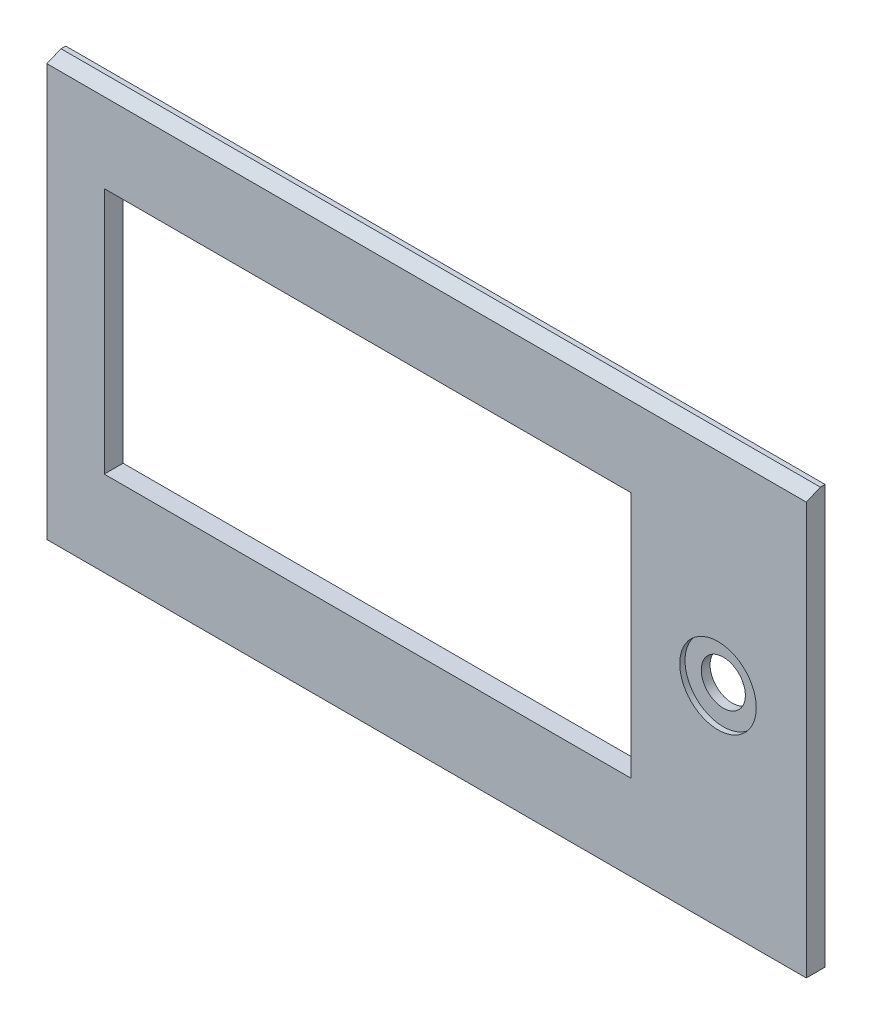
ISO-10303-21;
HEADER;
FILE_DESCRIPTION(('STEP AP214'),'2;1');
FILE_NAME('part.step','',(''),(''),'','','');
FILE_SCHEMA(('AUTOMOTIVE_DESIGN { 1 0 10303 214 1 1 1 1 }'));
ENDSEC;
DATA;
#1=APPLICATION_CONTEXT('core data for automotive mechanical design processes');
#2=APPLICATION_PROTOCOL_DEFINITION('international standard','automotive_design',2000,#1);
#3=PRODUCT_CONTEXT('',#1,'mechanical');
#4=PRODUCT('Part','Part','',(#3));
#5=PRODUCT_RELATED_PRODUCT_CATEGORY('part','',(#4));
#6=PRODUCT_DEFINITION_FORMATION('','',#4);
#7=PRODUCT_DEFINITION_CONTEXT('part definition',#1,'design');
#8=PRODUCT_DEFINITION('design','',#6,#7);
#9=PRODUCT_DEFINITION_SHAPE('','',#8);
#10=(LENGTH_UNIT() NAMED_UNIT(*) SI_UNIT(.MILLI.,.METRE.));
#11=(NAMED_UNIT(*) PLANE_ANGLE_UNIT() SI_UNIT($,.RADIAN.));
#12=(NAMED_UNIT(*) SI_UNIT($,.STERADIAN.) SOLID_ANGLE_UNIT());
#13=UNCERTAINTY_MEASURE_WITH_UNIT(LENGTH_MEASURE(1.E-05),#10,'distance_accuracy_value','');
#14=(GEOMETRIC_REPRESENTATION_CONTEXT(3) GLOBAL_UNCERTAINTY_ASSIGNED_CONTEXT((#13)) GLOBAL_UNIT_ASSIGNED_CONTEXT((#10,
#11,#12)) REPRESENTATION_CONTEXT('',''));
#15=CARTESIAN_POINT('',(0.,0.,0.));
#16=DIRECTION('',(0.,0.,1.));
#17=DIRECTION('',(1.,0.,0.));
#18=AXIS2_PLACEMENT_3D('',#15,#16,#17);
#19=CARTESIAN_POINT('',(104.25,21.,3.2));
#20=DIRECTION('',(0.,0.,-1.));
#21=DIRECTION('',(-1.,0.,0.));
#22=AXIS2_PLACEMENT_3D('',#19,#20,#21);
#23=CYLINDRICAL_SURFACE('',#22,3.75000000000001);
#24=CARTESIAN_POINT('',(104.25,21.,0.8));
#25=DIRECTION('',(0.,0.,1.));
#26=DIRECTION('',(1.,0.,0.));
#27=AXIS2_PLACEMENT_3D('',#24,#25,#26);
#28=CIRCLE('',#27,3.75000000000001);
#29=CARTESIAN_POINT('',(108.,21.,0.8));
#30=VERTEX_POINT('',#29);
#31=EDGE_CURVE('E175',#30,#30,#28,.T.);
#32=ORIENTED_EDGE('',*,*,#31,.F.);
#33=EDGE_LOOP('',(#32));
#34=FACE_BOUND('',#33,.T.);
#35=CARTESIAN_POINT('',(104.25,21.,2.3));
#36=DIRECTION('',(0.,0.,1.));
#37=DIRECTION('',(1.,0.,0.));
#38=AXIS2_PLACEMENT_3D('',#35,#36,#37);
#39=CIRCLE('',#38,3.75000000000001);
#40=CARTESIAN_POINT('',(108.,21.,2.3));
#41=VERTEX_POINT('',#40);
#42=EDGE_CURVE('E45',#41,#41,#39,.T.);
#43=ORIENTED_EDGE('',*,*,#42,.T.);
#44=EDGE_LOOP('',(#43));
#45=FACE_BOUND('',#44,.T.);
#46=ADVANCED_FACE('F41',(#34,#45),#23,.F.);
#47=CARTESIAN_POINT('',(89.5,0.,3.2));
#48=DIRECTION('',(-1.,0.,0.));
#49=DIRECTION('',(0.,0.,1.));
#50=AXIS2_PLACEMENT_3D('',#47,#48,#49);
#51=PLANE('',#50);
#52=DIRECTION('',(0.,1.,0.));
#53=VECTOR('',#52,1.);
#54=CARTESIAN_POINT('',(89.5,0.,0.));
#55=LINE('',#54,#53);
#56=CARTESIAN_POINT('',(89.5,0.,0.));
#57=VERTEX_POINT('',#56);
#58=CARTESIAN_POINT('',(89.5,42.,0.));
#59=VERTEX_POINT('',#58);
#60=EDGE_CURVE('E211',#57,#59,#55,.T.);
#61=ORIENTED_EDGE('',*,*,#60,.F.);
#62=DIRECTION('',(0.,0.,-1.));
#63=VECTOR('',#62,1.);
#64=CARTESIAN_POINT('',(89.5,0.,3.2));
#65=LINE('',#64,#63);
#66=CARTESIAN_POINT('',(89.5,0.,3.2));
#67=VERTEX_POINT('',#66);
#68=EDGE_CURVE('E230',#67,#57,#65,.T.);
#69=ORIENTED_EDGE('',*,*,#68,.F.);
#70=DIRECTION('',(0.,1.,0.));
#71=VECTOR('',#70,1.);
#72=CARTESIAN_POINT('',(89.5,0.,3.2));
#73=LINE('',#72,#71);
#74=CARTESIAN_POINT('',(89.5,42.,3.2));
#75=VERTEX_POINT('',#74);
#76=EDGE_CURVE('E187',#67,#75,#73,.T.);
#77=ORIENTED_EDGE('',*,*,#76,.T.);
#78=DIRECTION('',(0.,0.,-1.));
#79=VECTOR('',#78,1.);
#80=CARTESIAN_POINT('',(89.5,42.,3.2));
#81=LINE('',#80,#79);
#82=EDGE_CURVE('E222',#75,#59,#81,.T.);
#83=ORIENTED_EDGE('',*,*,#82,.T.);
#84=EDGE_LOOP('',(#61,#69,#77,#83));
#85=FACE_BOUND('',#84,.T.);
#86=ADVANCED_FACE('F250',(#85),#51,.T.);
#87=CARTESIAN_POINT('',(0.,0.,3.2));
#88=DIRECTION('',(0.,1.,0.));
#89=DIRECTION('',(0.,0.,1.));
#90=AXIS2_PLACEMENT_3D('',#87,#88,#89);
#91=PLANE('',#90);
#92=DIRECTION('',(1.,0.,0.));
#93=VECTOR('',#92,1.);
#94=CARTESIAN_POINT('',(0.,0.,0.));
#95=LINE('',#94,#93);
#96=CARTESIAN_POINT('',(0.,0.,0.));
#97=VERTEX_POINT('',#96);
#98=EDGE_CURVE('E214',#97,#57,#95,.T.);
#99=ORIENTED_EDGE('',*,*,#98,.F.);
#100=DIRECTION('',(0.,0.,-1.));
#101=VECTOR('',#100,1.);
#102=CARTESIAN_POINT('',(0.,0.,3.2));
#103=LINE('',#102,#101);
#104=CARTESIAN_POINT('',(0.,0.,3.2));
#105=VERTEX_POINT('',#104);
#106=EDGE_CURVE('E228',#105,#97,#103,.T.);
#107=ORIENTED_EDGE('',*,*,#106,.F.);
#108=DIRECTION('',(1.,0.,0.));
#109=VECTOR('',#108,1.);
#110=CARTESIAN_POINT('',(0.,0.,3.2));
#111=LINE('',#110,#109);
#112=EDGE_CURVE('E190',#105,#67,#111,.T.);
#113=ORIENTED_EDGE('',*,*,#112,.T.);
#114=ORIENTED_EDGE('',*,*,#68,.T.);
#115=EDGE_LOOP('',(#99,#107,#113,#114));
#116=FACE_BOUND('',#115,.T.);
#117=ADVANCED_FACE('F275',(#116),#91,.T.);
#118=CARTESIAN_POINT('',(0.,0.,3.2));
#119=DIRECTION('',(-1.,0.,0.));
#120=DIRECTION('',(0.,0.,1.));
#121=AXIS2_PLACEMENT_3D('',#118,#119,#120);
#122=PLANE('',#121);
#123=DIRECTION('',(0.,1.,0.));
#124=VECTOR('',#123,1.);
#125=CARTESIAN_POINT('',(0.,0.,0.));
#126=LINE('',#125,#124);
#127=CARTESIAN_POINT('',(0.,42.,0.));
#128=VERTEX_POINT('',#127);
#129=EDGE_CURVE('E217',#97,#128,#126,.T.);
#130=ORIENTED_EDGE('',*,*,#129,.T.);
#131=DIRECTION('',(0.,0.,-1.));
#132=VECTOR('',#131,1.);
#133=CARTESIAN_POINT('',(0.,42.,3.2));
#134=LINE('',#133,#132);
#135=CARTESIAN_POINT('',(0.,42.,3.2));
#136=VERTEX_POINT('',#135);
#137=EDGE_CURVE('E224',#136,#128,#134,.T.);
#138=ORIENTED_EDGE('',*,*,#137,.F.);
#139=DIRECTION('',(0.,1.,0.));
#140=VECTOR('',#139,1.);
#141=CARTESIAN_POINT('',(0.,0.,3.2));
#142=LINE('',#141,#140);
#143=EDGE_CURVE('E193',#105,#136,#142,.T.);
#144=ORIENTED_EDGE('',*,*,#143,.F.);
#145=ORIENTED_EDGE('',*,*,#106,.T.);
#146=EDGE_LOOP('',(#130,#138,#144,#145));
#147=FACE_BOUND('',#146,.T.);
#148=ADVANCED_FACE('F281',(#147),#122,.F.);
#149=CARTESIAN_POINT('',(119.25,0.,3.2));
#150=DIRECTION('',(1.,0.,0.));
#151=DIRECTION('',(0.,0.,-1.));
#152=AXIS2_PLACEMENT_3D('',#149,#150,#151);
#153=PLANE('',#152);
#154=DIRECTION('',(0.,0.,-1.));
#155=VECTOR('',#154,1.);
#156=CARTESIAN_POINT('',(119.25,56.5,3.2));
#157=LINE('',#156,#155);
#158=CARTESIAN_POINT('',(119.25,56.5,0.799999999999959));
#159=VERTEX_POINT('',#158);
#160=CARTESIAN_POINT('',(119.25,56.5,0.));
#161=VERTEX_POINT('',#160);
#162=EDGE_CURVE('E225',#159,#161,#157,.T.);
#163=ORIENTED_EDGE('',*,*,#162,.F.);
#164=DIRECTION('',(0.,0.382683432365086,-0.923879532511289));
#165=VECTOR('',#164,1.);
#166=CARTESIAN_POINT('',(119.25,47.3772384310963,22.8242947059437));
#167=LINE('',#166,#165);
#168=CARTESIAN_POINT('',(119.25,55.5058874503045,3.2));
#169=VERTEX_POINT('',#168);
#170=EDGE_CURVE('E242',#159,#169,#167,.F.);
#171=ORIENTED_EDGE('',*,*,#170,.T.);
#172=DIRECTION('',(0.,-1.,0.));
#173=VECTOR('',#172,1.);
#174=CARTESIAN_POINT('',(119.25,0.,3.2));
#175=LINE('',#174,#173);
#176=CARTESIAN_POINT('',(119.25,-14.5,3.2));
#177=VERTEX_POINT('',#176);
#178=EDGE_CURVE('E179',#169,#177,#175,.T.);
#179=ORIENTED_EDGE('',*,*,#178,.T.);
#180=DIRECTION('',(0.,0.,-1.));
#181=VECTOR('',#180,1.);
#182=CARTESIAN_POINT('',(119.25,-14.5,3.2));
#183=LINE('',#182,#181);
#184=CARTESIAN_POINT('',(119.25,-14.5,0.));
#185=VERTEX_POINT('',#184);
#186=EDGE_CURVE('E198',#177,#185,#183,.T.);
#187=ORIENTED_EDGE('',*,*,#186,.T.);
#188=DIRECTION('',(0.,-1.,0.));
#189=VECTOR('',#188,1.);
#190=CARTESIAN_POINT('',(119.25,0.,0.));
#191=LINE('',#190,#189);
#192=EDGE_CURVE('E199',#161,#185,#191,.T.);
#193=ORIENTED_EDGE('',*,*,#192,.F.);
#194=EDGE_LOOP('',(#163,#171,#179,#187,#193));
#195=FACE_BOUND('',#194,.T.);
#196=ADVANCED_FACE('F299',(#195),#153,.T.);
#197=CARTESIAN_POINT('',(0.,56.5000000000001,3.2));
#198=DIRECTION('',(0.,1.,0.));
#199=DIRECTION('',(-1.,0.,0.));
#200=AXIS2_PLACEMENT_3D('',#197,#198,#199);
#201=PLANE('',#200);
#202=DIRECTION('',(0.,0.,-1.));
#203=VECTOR('',#202,1.);
#204=CARTESIAN_POINT('',(-9.75,56.5,3.2));
#205=LINE('',#204,#203);
#206=CARTESIAN_POINT('',(-9.75,56.5,0.799999999999959));
#207=VERTEX_POINT('',#206);
#208=CARTESIAN_POINT('',(-9.75,56.5,0.));
#209=VERTEX_POINT('',#208);
#210=EDGE_CURVE('E237',#207,#209,#205,.T.);
#211=ORIENTED_EDGE('',*,*,#210,.F.);
#212=DIRECTION('',(1.,0.,0.));
#213=VECTOR('',#212,1.);
#214=CARTESIAN_POINT('',(0.,56.5000000000001,0.799999999999959));
#215=LINE('',#214,#213);
#216=EDGE_CURVE('E232',#207,#159,#215,.T.);
#217=ORIENTED_EDGE('',*,*,#216,.T.);
#218=ORIENTED_EDGE('',*,*,#162,.T.);
#219=DIRECTION('',(1.,0.,0.));
#220=VECTOR('',#219,1.);
#221=CARTESIAN_POINT('',(0.,56.5000000000001,0.));
#222=LINE('',#221,#220);
#223=EDGE_CURVE('E202',#209,#161,#222,.T.);
#224=ORIENTED_EDGE('',*,*,#223,.F.);
#225=EDGE_LOOP('',(#211,#217,#218,#224));
#226=FACE_BOUND('',#225,.T.);
#227=ADVANCED_FACE('F310',(#226),#201,.T.);
#228=CARTESIAN_POINT('',(-9.75,0.,3.2));
#229=DIRECTION('',(1.,0.,0.));
#230=DIRECTION('',(0.,0.,-1.));
#231=AXIS2_PLACEMENT_3D('',#228,#229,#230);
#232=PLANE('',#231);
#233=DIRECTION('',(0.,-1.,0.));
#234=VECTOR('',#233,1.);
#235=CARTESIAN_POINT('',(-9.75,0.,3.2));
#236=LINE('',#235,#234);
#237=CARTESIAN_POINT('',(-9.75,55.5058874503047,3.2));
#238=VERTEX_POINT('',#237);
#239=CARTESIAN_POINT('',(-9.75,-14.5,3.2));
#240=VERTEX_POINT('',#239);
#241=EDGE_CURVE('E181',#238,#240,#236,.T.);
#242=ORIENTED_EDGE('',*,*,#241,.F.);
#243=DIRECTION('',(0.,-0.382683432365086,0.923879532511289));
#244=VECTOR('',#243,1.);
#245=CARTESIAN_POINT('',(-9.75,56.5000000000002,0.799999999999964));
#246=LINE('',#245,#244);
#247=EDGE_CURVE('E12',#238,#207,#246,.F.);
#248=ORIENTED_EDGE('',*,*,#247,.T.);
#249=ORIENTED_EDGE('',*,*,#210,.T.);
#250=DIRECTION('',(0.,-1.,0.));
#251=VECTOR('',#250,1.);
#252=CARTESIAN_POINT('',(-9.75,0.,0.));
#253=LINE('',#252,#251);
#254=CARTESIAN_POINT('',(-9.75,-14.5,0.));
#255=VERTEX_POINT('',#254);
#256=EDGE_CURVE('E205',#209,#255,#253,.T.);
#257=ORIENTED_EDGE('',*,*,#256,.T.);
#258=DIRECTION('',(0.,0.,-1.));
#259=VECTOR('',#258,1.);
#260=CARTESIAN_POINT('',(-9.75,-14.5,3.2));
#261=LINE('',#260,#259);
#262=EDGE_CURVE('E234',#240,#255,#261,.T.);
#263=ORIENTED_EDGE('',*,*,#262,.F.);
#264=EDGE_LOOP('',(#242,#248,#249,#257,#263));
#265=FACE_BOUND('',#264,.T.);
#266=ADVANCED_FACE('F306',(#265),#232,.F.);
#267=CARTESIAN_POINT('',(0.,-14.5,3.2));
#268=DIRECTION('',(0.,1.,0.));
#269=DIRECTION('',(-1.,0.,0.));
#270=AXIS2_PLACEMENT_3D('',#267,#268,#269);
#271=PLANE('',#270);
#272=DIRECTION('',(1.,0.,0.));
#273=VECTOR('',#272,1.);
#274=CARTESIAN_POINT('',(0.,-14.5,0.));
#275=LINE('',#274,#273);
#276=EDGE_CURVE('E208',#255,#185,#275,.T.);
#277=ORIENTED_EDGE('',*,*,#276,.T.);
#278=ORIENTED_EDGE('',*,*,#186,.F.);
#279=DIRECTION('',(1.,0.,0.));
#280=VECTOR('',#279,1.);
#281=CARTESIAN_POINT('',(0.,-14.5,3.2));
#282=LINE('',#281,#280);
#283=EDGE_CURVE('E184',#240,#177,#282,.T.);
#284=ORIENTED_EDGE('',*,*,#283,.F.);
#285=ORIENTED_EDGE('',*,*,#262,.T.);
#286=EDGE_LOOP('',(#277,#278,#284,#285));
#287=FACE_BOUND('',#286,.T.);
#288=ADVANCED_FACE('F296',(#287),#271,.F.);
#289=CARTESIAN_POINT('',(0.,42.,3.2));
#290=DIRECTION('',(0.,1.,0.));
#291=DIRECTION('',(0.,0.,1.));
#292=AXIS2_PLACEMENT_3D('',#289,#290,#291);
#293=PLANE('',#292);
#294=DIRECTION('',(1.,0.,0.));
#295=VECTOR('',#294,1.);
#296=CARTESIAN_POINT('',(0.,42.,0.));
#297=LINE('',#296,#295);
#298=EDGE_CURVE('E182',#128,#59,#297,.T.);
#299=ORIENTED_EDGE('',*,*,#298,.T.);
#300=ORIENTED_EDGE('',*,*,#82,.F.);
#301=DIRECTION('',(1.,0.,0.));
#302=VECTOR('',#301,1.);
#303=CARTESIAN_POINT('',(0.,42.,3.2));
#304=LINE('',#303,#302);
#305=EDGE_CURVE('E196',#136,#75,#304,.T.);
#306=ORIENTED_EDGE('',*,*,#305,.F.);
#307=ORIENTED_EDGE('',*,*,#137,.T.);
#308=EDGE_LOOP('',(#299,#300,#306,#307));
#309=FACE_BOUND('',#308,.T.);
#310=ADVANCED_FACE('F266',(#309),#293,.F.);
#311=CARTESIAN_POINT('',(0.,0.,3.2));
#312=DIRECTION('',(0.,0.,1.));
#313=DIRECTION('',(1.,0.,0.));
#314=AXIS2_PLACEMENT_3D('',#311,#312,#313);
#315=PLANE('',#314);
#316=CARTESIAN_POINT('',(104.25,21.,3.2));
#317=DIRECTION('',(0.,0.,1.));
#318=DIRECTION('',(1.,0.,0.));
#319=AXIS2_PLACEMENT_3D('',#316,#317,#318);
#320=CIRCLE('',#319,6.5);
#321=CARTESIAN_POINT('',(110.75,21.,3.2));
#322=VERTEX_POINT('',#321);
#323=EDGE_CURVE('E255',#322,#322,#320,.T.);
#324=ORIENTED_EDGE('',*,*,#323,.F.);
#325=EDGE_LOOP('',(#324));
#326=FACE_BOUND('',#325,.T.);
#327=ORIENTED_EDGE('',*,*,#178,.F.);
#328=DIRECTION('',(-1.,0.,0.));
#329=VECTOR('',#328,1.);
#330=CARTESIAN_POINT('',(0.,55.5058874503047,3.2));
#331=LINE('',#330,#329);
#332=EDGE_CURVE('E50',#169,#238,#331,.T.);
#333=ORIENTED_EDGE('',*,*,#332,.T.);
#334=ORIENTED_EDGE('',*,*,#241,.T.);
#335=ORIENTED_EDGE('',*,*,#283,.T.);
#336=EDGE_LOOP('',(#327,#333,#334,#335));
#337=FACE_BOUND('',#336,.T.);
#338=ORIENTED_EDGE('',*,*,#76,.F.);
#339=ORIENTED_EDGE('',*,*,#112,.F.);
#340=ORIENTED_EDGE('',*,*,#143,.T.);
#341=ORIENTED_EDGE('',*,*,#305,.T.);
#342=EDGE_LOOP('',(#338,#339,#340,#341));
#343=FACE_BOUND('',#342,.T.);
#344=ADVANCED_FACE('F263',(#326,#337,#343),#315,.T.);
#345=CARTESIAN_POINT('',(0.,0.,0.));
#346=DIRECTION('',(0.,0.,1.));
#347=DIRECTION('',(1.,0.,0.));
#348=AXIS2_PLACEMENT_3D('',#345,#346,#347);
#349=PLANE('',#348);
#350=DIRECTION('',(-1.,0.,0.));
#351=VECTOR('',#350,1.);
#352=CARTESIAN_POINT('',(111.75,13.5,0.));
#353=LINE('',#352,#351);
#354=CARTESIAN_POINT('',(111.75,13.5,0.));
#355=VERTEX_POINT('',#354);
#356=CARTESIAN_POINT('',(96.75,13.5,0.));
#357=VERTEX_POINT('',#356);
#358=EDGE_CURVE('E169',#355,#357,#353,.T.);
#359=ORIENTED_EDGE('',*,*,#358,.F.);
#360=DIRECTION('',(0.,-1.,0.));
#361=VECTOR('',#360,1.);
#362=CARTESIAN_POINT('',(111.75,13.5,0.));
#363=LINE('',#362,#361);
#364=CARTESIAN_POINT('',(111.75,28.5,0.));
#365=VERTEX_POINT('',#364);
#366=EDGE_CURVE('E58',#365,#355,#363,.T.);
#367=ORIENTED_EDGE('',*,*,#366,.F.);
#368=DIRECTION('',(1.,0.,0.));
#369=VECTOR('',#368,1.);
#370=CARTESIAN_POINT('',(111.75,28.5,0.));
#371=LINE('',#370,#369);
#372=CARTESIAN_POINT('',(96.75,28.5,0.));
#373=VERTEX_POINT('',#372);
#374=EDGE_CURVE('E157',#373,#365,#371,.T.);
#375=ORIENTED_EDGE('',*,*,#374,.F.);
#376=DIRECTION('',(0.,1.,0.));
#377=VECTOR('',#376,1.);
#378=CARTESIAN_POINT('',(96.75,13.5,0.));
#379=LINE('',#378,#377);
#380=EDGE_CURVE('E160',#357,#373,#379,.T.);
#381=ORIENTED_EDGE('',*,*,#380,.F.);
#382=EDGE_LOOP('',(#359,#367,#375,#381));
#383=FACE_BOUND('',#382,.T.);
#384=ORIENTED_EDGE('',*,*,#192,.T.);
#385=ORIENTED_EDGE('',*,*,#276,.F.);
#386=ORIENTED_EDGE('',*,*,#256,.F.);
#387=ORIENTED_EDGE('',*,*,#223,.T.);
#388=EDGE_LOOP('',(#384,#385,#386,#387));
#389=FACE_BOUND('',#388,.T.);
#390=ORIENTED_EDGE('',*,*,#60,.T.);
#391=ORIENTED_EDGE('',*,*,#298,.F.);
#392=ORIENTED_EDGE('',*,*,#129,.F.);
#393=ORIENTED_EDGE('',*,*,#98,.T.);
#394=EDGE_LOOP('',(#390,#391,#392,#393));
#395=FACE_BOUND('',#394,.T.);
#396=ADVANCED_FACE('F265',(#383,#389,#395),#349,.F.);
#397=CARTESIAN_POINT('',(0.,56.5000000000001,0.799999999999959));
#398=DIRECTION('',(0.,-0.923879532511288,-0.382683432365086));
#399=DIRECTION('',(1.,0.,0.));
#400=AXIS2_PLACEMENT_3D('',#397,#398,#399);
#401=PLANE('',#400);
#402=ORIENTED_EDGE('',*,*,#247,.F.);
#403=ORIENTED_EDGE('',*,*,#332,.F.);
#404=ORIENTED_EDGE('',*,*,#170,.F.);
#405=ORIENTED_EDGE('',*,*,#216,.F.);
#406=EDGE_LOOP('',(#402,#403,#404,#405));
#407=FACE_BOUND('',#406,.T.);
#408=ADVANCED_FACE('F43',(#407),#401,.F.);
#409=CARTESIAN_POINT('',(111.75,13.5,0.8));
#410=DIRECTION('',(1.,0.,0.));
#411=DIRECTION('',(0.,0.,-1.));
#412=AXIS2_PLACEMENT_3D('',#409,#410,#411);
#413=PLANE('',#412);
#414=ORIENTED_EDGE('',*,*,#366,.T.);
#415=DIRECTION('',(0.,0.,-1.));
#416=VECTOR('',#415,1.);
#417=CARTESIAN_POINT('',(111.75,13.5,0.8));
#418=LINE('',#417,#416);
#419=CARTESIAN_POINT('',(111.75,13.5,0.8));
#420=VERTEX_POINT('',#419);
#421=EDGE_CURVE('E135',#420,#355,#418,.T.);
#422=ORIENTED_EDGE('',*,*,#421,.F.);
#423=DIRECTION('',(0.,-1.,0.));
#424=VECTOR('',#423,1.);
#425=CARTESIAN_POINT('',(111.75,13.5,0.8));
#426=LINE('',#425,#424);
#427=CARTESIAN_POINT('',(111.75,28.5,0.8));
#428=VERTEX_POINT('',#427);
#429=EDGE_CURVE('E139',#428,#420,#426,.T.);
#430=ORIENTED_EDGE('',*,*,#429,.F.);
#431=DIRECTION('',(0.,0.,-1.));
#432=VECTOR('',#431,1.);
#433=CARTESIAN_POINT('',(111.75,28.5,0.8));
#434=LINE('',#433,#432);
#435=EDGE_CURVE('E173',#428,#365,#434,.T.);
#436=ORIENTED_EDGE('',*,*,#435,.T.);
#437=EDGE_LOOP('',(#414,#422,#430,#436));
#438=FACE_BOUND('',#437,.T.);
#439=ADVANCED_FACE('F137',(#438),#413,.F.);
#440=CARTESIAN_POINT('',(111.75,28.5,0.8));
#441=DIRECTION('',(0.,1.,0.));
#442=DIRECTION('',(-1.,0.,0.));
#443=AXIS2_PLACEMENT_3D('',#440,#441,#442);
#444=PLANE('',#443);
#445=ORIENTED_EDGE('',*,*,#374,.T.);
#446=ORIENTED_EDGE('',*,*,#435,.F.);
#447=DIRECTION('',(1.,0.,0.));
#448=VECTOR('',#447,1.);
#449=CARTESIAN_POINT('',(111.75,28.5,0.8));
#450=LINE('',#449,#448);
#451=CARTESIAN_POINT('',(96.75,28.5,0.8));
#452=VERTEX_POINT('',#451);
#453=EDGE_CURVE('E145',#452,#428,#450,.T.);
#454=ORIENTED_EDGE('',*,*,#453,.F.);
#455=DIRECTION('',(0.,0.,-1.));
#456=VECTOR('',#455,1.);
#457=CARTESIAN_POINT('',(96.75,28.5,0.8));
#458=LINE('',#457,#456);
#459=EDGE_CURVE('E176',#452,#373,#458,.T.);
#460=ORIENTED_EDGE('',*,*,#459,.T.);
#461=EDGE_LOOP('',(#445,#446,#454,#460));
#462=FACE_BOUND('',#461,.T.);
#463=ADVANCED_FACE('F382',(#462),#444,.F.);
#464=CARTESIAN_POINT('',(96.75,13.5,0.8));
#465=DIRECTION('',(-1.,0.,0.));
#466=DIRECTION('',(0.,0.,1.));
#467=AXIS2_PLACEMENT_3D('',#464,#465,#466);
#468=PLANE('',#467);
#469=ORIENTED_EDGE('',*,*,#380,.T.);
#470=ORIENTED_EDGE('',*,*,#459,.F.);
#471=DIRECTION('',(0.,1.,0.));
#472=VECTOR('',#471,1.);
#473=CARTESIAN_POINT('',(96.75,13.5,0.8));
#474=LINE('',#473,#472);
#475=CARTESIAN_POINT('',(96.75,13.5,0.8));
#476=VERTEX_POINT('',#475);
#477=EDGE_CURVE('E153',#476,#452,#474,.T.);
#478=ORIENTED_EDGE('',*,*,#477,.F.);
#479=DIRECTION('',(0.,0.,-1.));
#480=VECTOR('',#479,1.);
#481=CARTESIAN_POINT('',(96.75,13.5,0.8));
#482=LINE('',#481,#480);
#483=EDGE_CURVE('E144',#476,#357,#482,.T.);
#484=ORIENTED_EDGE('',*,*,#483,.T.);
#485=EDGE_LOOP('',(#469,#470,#478,#484));
#486=FACE_BOUND('',#485,.T.);
#487=ADVANCED_FACE('F385',(#486),#468,.F.);
#488=CARTESIAN_POINT('',(111.75,13.5,0.8));
#489=DIRECTION('',(0.,-1.,0.));
#490=DIRECTION('',(1.,0.,0.));
#491=AXIS2_PLACEMENT_3D('',#488,#489,#490);
#492=PLANE('',#491);
#493=ORIENTED_EDGE('',*,*,#358,.T.);
#494=ORIENTED_EDGE('',*,*,#483,.F.);
#495=DIRECTION('',(-1.,0.,0.));
#496=VECTOR('',#495,1.);
#497=CARTESIAN_POINT('',(111.75,13.5,0.8));
#498=LINE('',#497,#496);
#499=EDGE_CURVE('E148',#420,#476,#498,.T.);
#500=ORIENTED_EDGE('',*,*,#499,.F.);
#501=ORIENTED_EDGE('',*,*,#421,.T.);
#502=EDGE_LOOP('',(#493,#494,#500,#501));
#503=FACE_BOUND('',#502,.T.);
#504=ADVANCED_FACE('F149',(#503),#492,.F.);
#505=CARTESIAN_POINT('',(0.,0.,0.8));
#506=DIRECTION('',(0.,0.,1.));
#507=DIRECTION('',(1.,0.,0.));
#508=AXIS2_PLACEMENT_3D('',#505,#506,#507);
#509=PLANE('',#508);
#510=ORIENTED_EDGE('',*,*,#31,.T.);
#511=EDGE_LOOP('',(#510));
#512=FACE_BOUND('',#511,.T.);
#513=ORIENTED_EDGE('',*,*,#429,.T.);
#514=ORIENTED_EDGE('',*,*,#499,.T.);
#515=ORIENTED_EDGE('',*,*,#477,.T.);
#516=ORIENTED_EDGE('',*,*,#453,.T.);
#517=EDGE_LOOP('',(#513,#514,#515,#516));
#518=FACE_BOUND('',#517,.T.);
#519=ADVANCED_FACE('F155',(#512,#518),#509,.F.);
#520=CARTESIAN_POINT('',(104.25,21.,-17.5847763108502));
#521=DIRECTION('',(0.,0.,1.));
#522=DIRECTION('',(1.,0.,0.));
#523=AXIS2_PLACEMENT_3D('',#520,#521,#522);
#524=CYLINDRICAL_SURFACE('',#523,6.5);
#525=CARTESIAN_POINT('',(104.25,21.,2.3));
#526=DIRECTION('',(0.,0.,1.));
#527=DIRECTION('',(1.,0.,0.));
#528=AXIS2_PLACEMENT_3D('',#525,#526,#527);
#529=CIRCLE('',#528,6.5);
#530=CARTESIAN_POINT('',(110.75,21.,2.3));
#531=VERTEX_POINT('',#530);
#532=EDGE_CURVE('E163',#531,#531,#529,.F.);
#533=ORIENTED_EDGE('',*,*,#532,.T.);
#534=EDGE_LOOP('',(#533));
#535=FACE_BOUND('',#534,.T.);
#536=ORIENTED_EDGE('',*,*,#323,.T.);
#537=EDGE_LOOP('',(#536));
#538=FACE_BOUND('',#537,.T.);
#539=ADVANCED_FACE('F261',(#535,#538),#524,.F.);
#540=CARTESIAN_POINT('',(0.,0.,2.3));
#541=DIRECTION('',(0.,0.,1.));
#542=DIRECTION('',(1.,0.,0.));
#543=AXIS2_PLACEMENT_3D('',#540,#541,#542);
#544=PLANE('',#543);
#545=ORIENTED_EDGE('',*,*,#42,.F.);
#546=EDGE_LOOP('',(#545));
#547=FACE_BOUND('',#546,.T.);
#548=ORIENTED_EDGE('',*,*,#532,.F.);
#549=EDGE_LOOP('',(#548));
#550=FACE_BOUND('',#549,.T.);
#551=ADVANCED_FACE('F366',(#547,#550),#544,.T.);
#552=CLOSED_SHELL('',(#46,#86,#117,#148,#196,#227,#266,#288,#310,#344,#396,#408,#439,#463,#487,
#504,#519,#539,#551));
#553=MANIFOLD_SOLID_BREP('B2',#552);
#554=ADVANCED_BREP_SHAPE_REPRESENTATION('',(#18,#553),#14);
#555=SHAPE_DEFINITION_REPRESENTATION(#9,#554);
ENDSEC;
END-ISO-10303-21;
